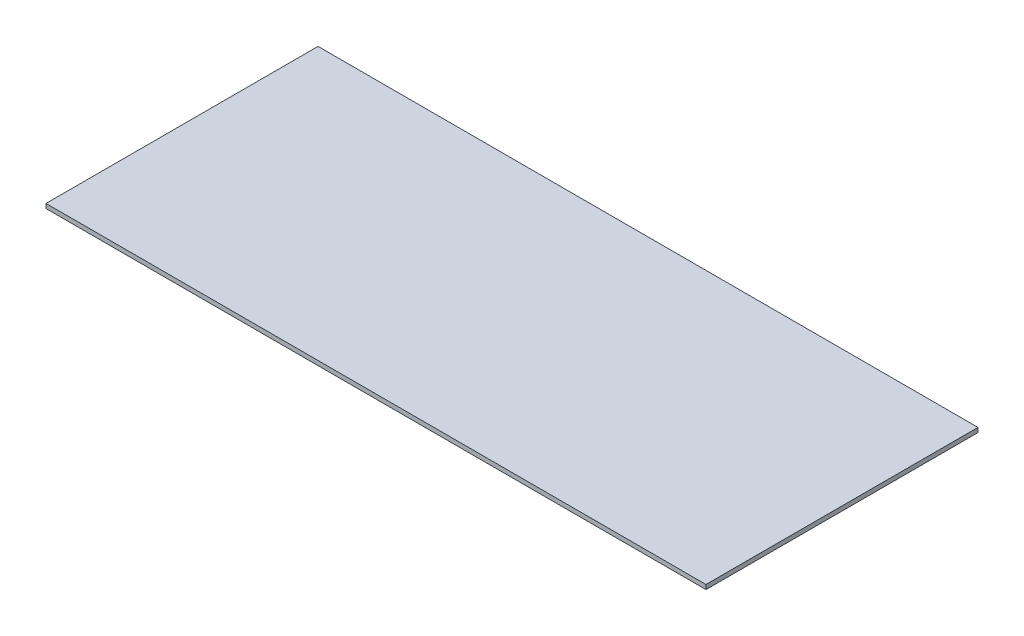
ISO-10303-21;
HEADER;
FILE_DESCRIPTION(('STEP AP214'),'2;1');
FILE_NAME('part.step','',(''),(''),'','','');
FILE_SCHEMA(('AUTOMOTIVE_DESIGN { 1 0 10303 214 1 1 1 1 }'));
ENDSEC;
DATA;
#1=APPLICATION_CONTEXT('core data for automotive mechanical design processes');
#2=APPLICATION_PROTOCOL_DEFINITION('international standard','automotive_design',2000,#1);
#3=PRODUCT_CONTEXT('',#1,'mechanical');
#4=PRODUCT('Part','Part','',(#3));
#5=PRODUCT_RELATED_PRODUCT_CATEGORY('part','',(#4));
#6=PRODUCT_DEFINITION_FORMATION('','',#4);
#7=PRODUCT_DEFINITION_CONTEXT('part definition',#1,'design');
#8=PRODUCT_DEFINITION('design','',#6,#7);
#9=PRODUCT_DEFINITION_SHAPE('','',#8);
#10=(LENGTH_UNIT() NAMED_UNIT(*) SI_UNIT(.MILLI.,.METRE.));
#11=(NAMED_UNIT(*) PLANE_ANGLE_UNIT() SI_UNIT($,.RADIAN.));
#12=(NAMED_UNIT(*) SI_UNIT($,.STERADIAN.) SOLID_ANGLE_UNIT());
#13=UNCERTAINTY_MEASURE_WITH_UNIT(LENGTH_MEASURE(1.E-05),#10,'distance_accuracy_value','');
#14=(GEOMETRIC_REPRESENTATION_CONTEXT(3) GLOBAL_UNCERTAINTY_ASSIGNED_CONTEXT((#13)) GLOBAL_UNIT_ASSIGNED_CONTEXT((#10,
#11,#12)) REPRESENTATION_CONTEXT('',''));
#15=CARTESIAN_POINT('',(0.,0.,0.));
#16=DIRECTION('',(0.,0.,1.));
#17=DIRECTION('',(1.,0.,0.));
#18=AXIS2_PLACEMENT_3D('',#15,#16,#17);
#19=CARTESIAN_POINT('',(0.,10.,0.));
#20=DIRECTION('',(1.,0.,0.));
#21=DIRECTION('',(0.,0.,-1.));
#22=AXIS2_PLACEMENT_3D('',#19,#20,#21);
#23=PLANE('',#22);
#24=DIRECTION('',(0.,0.,1.));
#25=VECTOR('',#24,1.);
#26=CARTESIAN_POINT('',(0.,0.,0.));
#27=LINE('',#26,#25);
#28=CARTESIAN_POINT('',(0.,0.,-610.));
#29=VERTEX_POINT('',#28);
#30=CARTESIAN_POINT('',(0.,0.,0.));
#31=VERTEX_POINT('',#30);
#32=EDGE_CURVE('E96',#29,#31,#27,.T.);
#33=ORIENTED_EDGE('',*,*,#32,.T.);
#34=DIRECTION('',(0.,-1.,0.));
#35=VECTOR('',#34,1.);
#36=CARTESIAN_POINT('',(0.,10.,0.));
#37=LINE('',#36,#35);
#38=CARTESIAN_POINT('',(0.,10.,0.));
#39=VERTEX_POINT('',#38);
#40=EDGE_CURVE('E11',#39,#31,#37,.T.);
#41=ORIENTED_EDGE('',*,*,#40,.F.);
#42=DIRECTION('',(0.,0.,1.));
#43=VECTOR('',#42,1.);
#44=CARTESIAN_POINT('',(0.,10.,0.));
#45=LINE('',#44,#43);
#46=CARTESIAN_POINT('',(0.,10.,-610.));
#47=VERTEX_POINT('',#46);
#48=EDGE_CURVE('E84',#47,#39,#45,.T.);
#49=ORIENTED_EDGE('',*,*,#48,.F.);
#50=DIRECTION('',(0.,-1.,0.));
#51=VECTOR('',#50,1.);
#52=CARTESIAN_POINT('',(0.,10.,-610.));
#53=LINE('',#52,#51);
#54=EDGE_CURVE('E92',#47,#29,#53,.T.);
#55=ORIENTED_EDGE('',*,*,#54,.T.);
#56=EDGE_LOOP('',(#33,#41,#49,#55));
#57=FACE_BOUND('',#56,.T.);
#58=ADVANCED_FACE('F33',(#57),#23,.F.);
#59=CARTESIAN_POINT('',(0.,10.,0.));
#60=DIRECTION('',(0.,0.,-1.));
#61=DIRECTION('',(-1.,0.,0.));
#62=AXIS2_PLACEMENT_3D('',#59,#60,#61);
#63=PLANE('',#62);
#64=DIRECTION('',(1.,0.,0.));
#65=VECTOR('',#64,1.);
#66=CARTESIAN_POINT('',(0.,0.,0.));
#67=LINE('',#66,#65);
#68=CARTESIAN_POINT('',(1480.,0.,0.));
#69=VERTEX_POINT('',#68);
#70=EDGE_CURVE('E88',#31,#69,#67,.T.);
#71=ORIENTED_EDGE('',*,*,#70,.T.);
#72=DIRECTION('',(0.,-1.,0.));
#73=VECTOR('',#72,1.);
#74=CARTESIAN_POINT('',(1480.,10.,0.));
#75=LINE('',#74,#73);
#76=CARTESIAN_POINT('',(1480.,10.,0.));
#77=VERTEX_POINT('',#76);
#78=EDGE_CURVE('E41',#77,#69,#75,.T.);
#79=ORIENTED_EDGE('',*,*,#78,.F.);
#80=DIRECTION('',(1.,0.,0.));
#81=VECTOR('',#80,1.);
#82=CARTESIAN_POINT('',(0.,10.,0.));
#83=LINE('',#82,#81);
#84=EDGE_CURVE('E79',#39,#77,#83,.T.);
#85=ORIENTED_EDGE('',*,*,#84,.F.);
#86=ORIENTED_EDGE('',*,*,#40,.T.);
#87=EDGE_LOOP('',(#71,#79,#85,#86));
#88=FACE_BOUND('',#87,.T.);
#89=ADVANCED_FACE('F87',(#88),#63,.F.);
#90=CARTESIAN_POINT('',(1480.,10.,0.));
#91=DIRECTION('',(-1.,0.,0.));
#92=DIRECTION('',(0.,0.,1.));
#93=AXIS2_PLACEMENT_3D('',#90,#91,#92);
#94=PLANE('',#93);
#95=DIRECTION('',(0.,0.,-1.));
#96=VECTOR('',#95,1.);
#97=CARTESIAN_POINT('',(1480.,0.,0.));
#98=LINE('',#97,#96);
#99=CARTESIAN_POINT('',(1480.,0.,-610.));
#100=VERTEX_POINT('',#99);
#101=EDGE_CURVE('E66',#69,#100,#98,.T.);
#102=ORIENTED_EDGE('',*,*,#101,.T.);
#103=DIRECTION('',(0.,-1.,0.));
#104=VECTOR('',#103,1.);
#105=CARTESIAN_POINT('',(1480.,10.,-610.));
#106=LINE('',#105,#104);
#107=CARTESIAN_POINT('',(1480.,10.,-610.));
#108=VERTEX_POINT('',#107);
#109=EDGE_CURVE('E89',#108,#100,#106,.T.);
#110=ORIENTED_EDGE('',*,*,#109,.F.);
#111=DIRECTION('',(0.,0.,-1.));
#112=VECTOR('',#111,1.);
#113=CARTESIAN_POINT('',(1480.,10.,0.));
#114=LINE('',#113,#112);
#115=EDGE_CURVE('E82',#77,#108,#114,.T.);
#116=ORIENTED_EDGE('',*,*,#115,.F.);
#117=ORIENTED_EDGE('',*,*,#78,.T.);
#118=EDGE_LOOP('',(#102,#110,#116,#117));
#119=FACE_BOUND('',#118,.T.);
#120=ADVANCED_FACE('F90',(#119),#94,.F.);
#121=CARTESIAN_POINT('',(0.,10.,-610.));
#122=DIRECTION('',(0.,0.,1.));
#123=DIRECTION('',(1.,0.,0.));
#124=AXIS2_PLACEMENT_3D('',#121,#122,#123);
#125=PLANE('',#124);
#126=DIRECTION('',(-1.,0.,0.));
#127=VECTOR('',#126,1.);
#128=CARTESIAN_POINT('',(0.,0.,-610.));
#129=LINE('',#128,#127);
#130=EDGE_CURVE('E72',#100,#29,#129,.T.);
#131=ORIENTED_EDGE('',*,*,#130,.T.);
#132=ORIENTED_EDGE('',*,*,#54,.F.);
#133=DIRECTION('',(-1.,0.,0.));
#134=VECTOR('',#133,1.);
#135=CARTESIAN_POINT('',(0.,10.,-610.));
#136=LINE('',#135,#134);
#137=EDGE_CURVE('E49',#108,#47,#136,.T.);
#138=ORIENTED_EDGE('',*,*,#137,.F.);
#139=ORIENTED_EDGE('',*,*,#109,.T.);
#140=EDGE_LOOP('',(#131,#132,#138,#139));
#141=FACE_BOUND('',#140,.T.);
#142=ADVANCED_FACE('F103',(#141),#125,.F.);
#143=CARTESIAN_POINT('',(0.,10.,0.));
#144=DIRECTION('',(0.,-1.,0.));
#145=DIRECTION('',(0.,0.,-1.));
#146=AXIS2_PLACEMENT_3D('',#143,#144,#145);
#147=PLANE('',#146);
#148=ORIENTED_EDGE('',*,*,#48,.T.);
#149=ORIENTED_EDGE('',*,*,#84,.T.);
#150=ORIENTED_EDGE('',*,*,#115,.T.);
#151=ORIENTED_EDGE('',*,*,#137,.T.);
#152=EDGE_LOOP('',(#148,#149,#150,#151));
#153=FACE_BOUND('',#152,.T.);
#154=ADVANCED_FACE('F80',(#153),#147,.F.);
#155=CARTESIAN_POINT('',(0.,0.,0.));
#156=DIRECTION('',(0.,-1.,0.));
#157=DIRECTION('',(0.,0.,-1.));
#158=AXIS2_PLACEMENT_3D('',#155,#156,#157);
#159=PLANE('',#158);
#160=ORIENTED_EDGE('',*,*,#32,.F.);
#161=ORIENTED_EDGE('',*,*,#130,.F.);
#162=ORIENTED_EDGE('',*,*,#101,.F.);
#163=ORIENTED_EDGE('',*,*,#70,.F.);
#164=EDGE_LOOP('',(#160,#161,#162,#163));
#165=FACE_BOUND('',#164,.T.);
#166=ADVANCED_FACE('F106',(#165),#159,.T.);
#167=CLOSED_SHELL('',(#58,#89,#120,#142,#154,#166));
#168=MANIFOLD_SOLID_BREP('B2',#167);
#169=ADVANCED_BREP_SHAPE_REPRESENTATION('',(#18,#168),#14);
#170=SHAPE_DEFINITION_REPRESENTATION(#9,#169);
ENDSEC;
END-ISO-10303-21;
